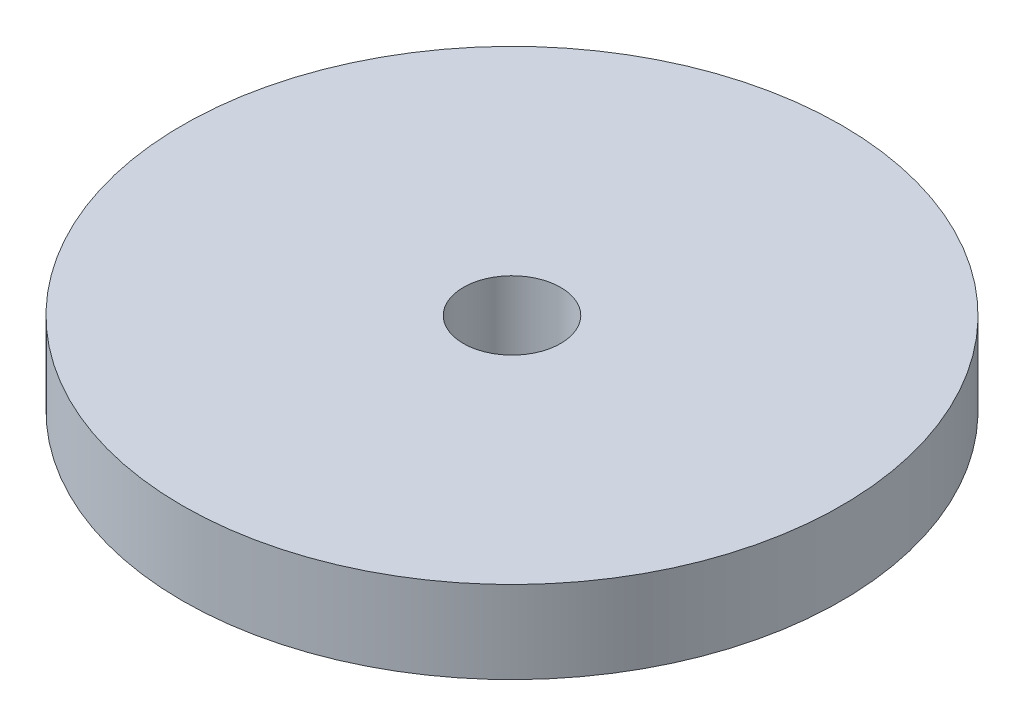
ISO-10303-21;
HEADER;
FILE_DESCRIPTION(('STEP AP214'),'2;1');
FILE_NAME('part.step','',(''),(''),'','','');
FILE_SCHEMA(('AUTOMOTIVE_DESIGN { 1 0 10303 214 1 1 1 1 }'));
ENDSEC;
DATA;
#1=APPLICATION_CONTEXT('core data for automotive mechanical design processes');
#2=APPLICATION_PROTOCOL_DEFINITION('international standard','automotive_design',2000,#1);
#3=PRODUCT_CONTEXT('',#1,'mechanical');
#4=PRODUCT('Part','Part','',(#3));
#5=PRODUCT_RELATED_PRODUCT_CATEGORY('part','',(#4));
#6=PRODUCT_DEFINITION_FORMATION('','',#4);
#7=PRODUCT_DEFINITION_CONTEXT('part definition',#1,'design');
#8=PRODUCT_DEFINITION('design','',#6,#7);
#9=PRODUCT_DEFINITION_SHAPE('','',#8);
#10=(LENGTH_UNIT() NAMED_UNIT(*) SI_UNIT(.MILLI.,.METRE.));
#11=(NAMED_UNIT(*) PLANE_ANGLE_UNIT() SI_UNIT($,.RADIAN.));
#12=(NAMED_UNIT(*) SI_UNIT($,.STERADIAN.) SOLID_ANGLE_UNIT());
#13=UNCERTAINTY_MEASURE_WITH_UNIT(LENGTH_MEASURE(1.E-05),#10,'distance_accuracy_value','');
#14=(GEOMETRIC_REPRESENTATION_CONTEXT(3) GLOBAL_UNCERTAINTY_ASSIGNED_CONTEXT((#13)) GLOBAL_UNIT_ASSIGNED_CONTEXT((#10,
#11,#12)) REPRESENTATION_CONTEXT('',''));
#15=CARTESIAN_POINT('',(0.,0.,0.));
#16=DIRECTION('',(0.,0.,1.));
#17=DIRECTION('',(1.,0.,0.));
#18=AXIS2_PLACEMENT_3D('',#15,#16,#17);
#19=CARTESIAN_POINT('',(0.,2.54,0.));
#20=DIRECTION('',(0.,1.,0.));
#21=DIRECTION('',(0.,0.,1.));
#22=AXIS2_PLACEMENT_3D('',#19,#20,#21);
#23=PLANE('',#22);
#24=CARTESIAN_POINT('',(0.,2.54,0.));
#25=DIRECTION('',(0.,1.,0.));
#26=DIRECTION('',(0.,0.,1.));
#27=AXIS2_PLACEMENT_3D('',#24,#25,#26);
#28=CIRCLE('',#27,10.16);
#29=CARTESIAN_POINT('',(0.,2.54,10.16));
#30=VERTEX_POINT('',#29);
#31=EDGE_CURVE('E10',#30,#30,#28,.T.);
#32=ORIENTED_EDGE('',*,*,#31,.T.);
#33=EDGE_LOOP('',(#32));
#34=FACE_BOUND('',#33,.T.);
#35=CARTESIAN_POINT('',(0.,2.54,0.));
#36=DIRECTION('',(0.,1.,0.));
#37=DIRECTION('',(0.,0.,1.));
#38=AXIS2_PLACEMENT_3D('',#35,#36,#37);
#39=CIRCLE('',#38,1.5);
#40=CARTESIAN_POINT('',(0.,2.54,1.5));
#41=VERTEX_POINT('',#40);
#42=EDGE_CURVE('E50',#41,#41,#39,.T.);
#43=ORIENTED_EDGE('',*,*,#42,.F.);
#44=EDGE_LOOP('',(#43));
#45=FACE_BOUND('',#44,.T.);
#46=ADVANCED_FACE('F39',(#34,#45),#23,.T.);
#47=CARTESIAN_POINT('',(0.,0.,0.));
#48=DIRECTION('',(0.,1.,0.));
#49=DIRECTION('',(0.,0.,1.));
#50=AXIS2_PLACEMENT_3D('',#47,#48,#49);
#51=PLANE('',#50);
#52=CARTESIAN_POINT('',(0.,0.,0.));
#53=DIRECTION('',(0.,1.,0.));
#54=DIRECTION('',(0.,0.,1.));
#55=AXIS2_PLACEMENT_3D('',#52,#53,#54);
#56=CIRCLE('',#55,10.16);
#57=CARTESIAN_POINT('',(0.,0.,10.16));
#58=VERTEX_POINT('',#57);
#59=EDGE_CURVE('E43',#58,#58,#56,.T.);
#60=ORIENTED_EDGE('',*,*,#59,.F.);
#61=EDGE_LOOP('',(#60));
#62=FACE_BOUND('',#61,.T.);
#63=CARTESIAN_POINT('',(0.,0.,0.));
#64=DIRECTION('',(0.,1.,0.));
#65=DIRECTION('',(0.,0.,1.));
#66=AXIS2_PLACEMENT_3D('',#63,#64,#65);
#67=CIRCLE('',#66,1.5);
#68=CARTESIAN_POINT('',(0.,0.,1.5));
#69=VERTEX_POINT('',#68);
#70=EDGE_CURVE('E52',#69,#69,#67,.T.);
#71=ORIENTED_EDGE('',*,*,#70,.T.);
#72=EDGE_LOOP('',(#71));
#73=FACE_BOUND('',#72,.T.);
#74=ADVANCED_FACE('F62',(#62,#73),#51,.F.);
#75=CARTESIAN_POINT('',(0.,2.54,0.));
#76=DIRECTION('',(0.,-1.,0.));
#77=DIRECTION('',(0.,0.,-1.));
#78=AXIS2_PLACEMENT_3D('',#75,#76,#77);
#79=CYLINDRICAL_SURFACE('',#78,10.16);
#80=ORIENTED_EDGE('',*,*,#31,.F.);
#81=EDGE_LOOP('',(#80));
#82=FACE_BOUND('',#81,.T.);
#83=ORIENTED_EDGE('',*,*,#59,.T.);
#84=EDGE_LOOP('',(#83));
#85=FACE_BOUND('',#84,.T.);
#86=ADVANCED_FACE('F41',(#82,#85),#79,.T.);
#87=CARTESIAN_POINT('',(0.,2.54,0.));
#88=DIRECTION('',(0.,-1.,0.));
#89=DIRECTION('',(0.,0.,-1.));
#90=AXIS2_PLACEMENT_3D('',#87,#88,#89);
#91=CYLINDRICAL_SURFACE('',#90,1.5);
#92=ORIENTED_EDGE('',*,*,#42,.T.);
#93=EDGE_LOOP('',(#92));
#94=FACE_BOUND('',#93,.T.);
#95=ORIENTED_EDGE('',*,*,#70,.F.);
#96=EDGE_LOOP('',(#95));
#97=FACE_BOUND('',#96,.T.);
#98=ADVANCED_FACE('F58',(#94,#97),#91,.F.);
#99=CLOSED_SHELL('',(#46,#74,#86,#98));
#100=MANIFOLD_SOLID_BREP('B2',#99);
#101=ADVANCED_BREP_SHAPE_REPRESENTATION('',(#18,#100),#14);
#102=SHAPE_DEFINITION_REPRESENTATION(#9,#101);
ENDSEC;
END-ISO-10303-21;
